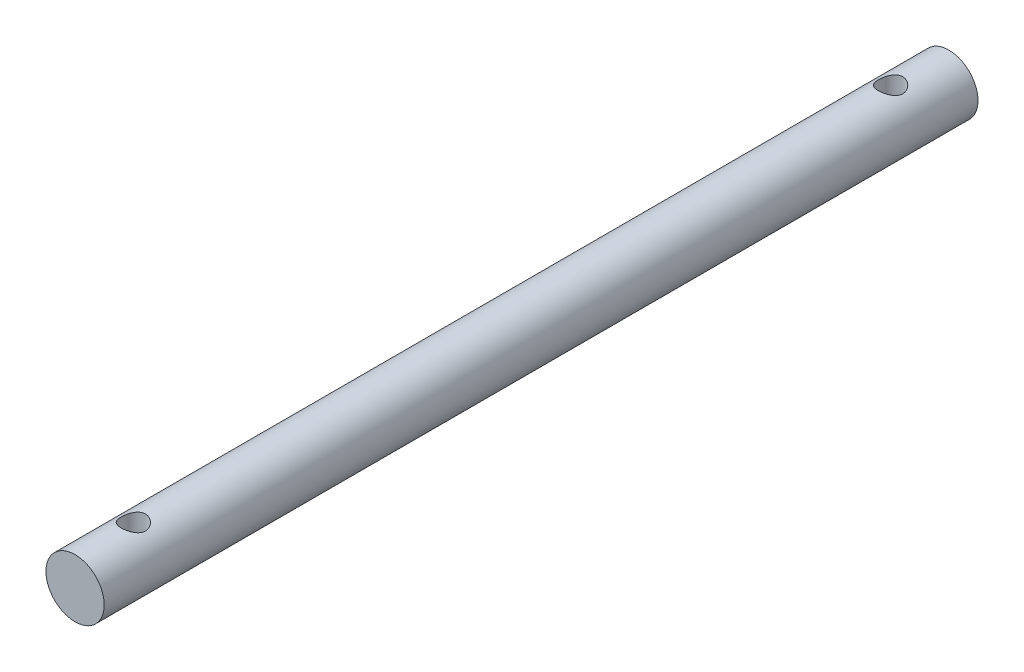
ISO-10303-21;
HEADER;
FILE_DESCRIPTION(('STEP AP214'),'2;1');
FILE_NAME('part.step','',(''),(''),'','','');
FILE_SCHEMA(('AUTOMOTIVE_DESIGN { 1 0 10303 214 1 1 1 1 }'));
ENDSEC;
DATA;
#1=APPLICATION_CONTEXT('core data for automotive mechanical design processes');
#2=APPLICATION_PROTOCOL_DEFINITION('international standard','automotive_design',2000,#1);
#3=PRODUCT_CONTEXT('',#1,'mechanical');
#4=PRODUCT('Part','Part','',(#3));
#5=PRODUCT_RELATED_PRODUCT_CATEGORY('part','',(#4));
#6=PRODUCT_DEFINITION_FORMATION('','',#4);
#7=PRODUCT_DEFINITION_CONTEXT('part definition',#1,'design');
#8=PRODUCT_DEFINITION('design','',#6,#7);
#9=PRODUCT_DEFINITION_SHAPE('','',#8);
#10=(LENGTH_UNIT() NAMED_UNIT(*) SI_UNIT(.MILLI.,.METRE.));
#11=(NAMED_UNIT(*) PLANE_ANGLE_UNIT() SI_UNIT($,.RADIAN.));
#12=(NAMED_UNIT(*) SI_UNIT($,.STERADIAN.) SOLID_ANGLE_UNIT());
#13=UNCERTAINTY_MEASURE_WITH_UNIT(LENGTH_MEASURE(1.E-05),#10,'distance_accuracy_value','');
#14=(GEOMETRIC_REPRESENTATION_CONTEXT(3) GLOBAL_UNCERTAINTY_ASSIGNED_CONTEXT((#13)) GLOBAL_UNIT_ASSIGNED_CONTEXT((#10,
#11,#12)) REPRESENTATION_CONTEXT('',''));
#15=CARTESIAN_POINT('',(0.,0.,0.));
#16=DIRECTION('',(0.,0.,1.));
#17=DIRECTION('',(1.,0.,0.));
#18=AXIS2_PLACEMENT_3D('',#15,#16,#17);
#19=CARTESIAN_POINT('',(0.,0.,75.));
#20=DIRECTION('',(0.,0.,-1.));
#21=DIRECTION('',(-1.,0.,0.));
#22=AXIS2_PLACEMENT_3D('',#19,#20,#21);
#23=CYLINDRICAL_SURFACE('',#22,5.);
#24=CARTESIAN_POINT('',(0.,-5.,-62.9172));
#25=CARTESIAN_POINT('',(0.111578839237877,-4.99999352611889,-62.9172085313426));
#26=CARTESIAN_POINT('',(0.223319012424018,-4.99622299792187,-62.9262170888932));
#27=CARTESIAN_POINT('',(0.443639965609425,-4.98151051378845,-62.9619233164241));
#28=CARTESIAN_POINT('',(0.552211724531302,-4.97054983959883,-62.9886671590212));
#29=CARTESIAN_POINT('',(0.762637813677016,-4.94263183056272,-63.0586888874491));
#30=CARTESIAN_POINT('',(0.864513539096639,-4.9256948193072,-63.1019107763548));
#31=CARTESIAN_POINT('',(1.05947015937177,-4.88747422640062,-63.2034295529761));
#32=CARTESIAN_POINT('',(1.1525537090778,-4.86619196300104,-63.2617218700882));
#33=CARTESIAN_POINT('',(1.33210266923288,-4.8202160508905,-63.3948171856856));
#34=CARTESIAN_POINT('',(1.41806885086017,-4.79541072012145,-63.4702547327041));
#35=CARTESIAN_POINT('',(1.57655871227419,-4.74566918585628,-63.634157394833));
#36=CARTESIAN_POINT('',(1.64907531762347,-4.72073292053983,-63.7226293223374));
#37=CARTESIAN_POINT('',(1.78213062864076,-4.67218133245092,-63.9153630572728));
#38=CARTESIAN_POINT('',(1.8419050314518,-4.64869125387419,-64.0201873654964));
#39=CARTESIAN_POINT('',(1.94275027532528,-4.60746260126555,-64.2395231219599));
#40=CARTESIAN_POINT('',(1.98383074680611,-4.58972106715691,-64.3540295461971));
#41=CARTESIAN_POINT('',(2.04406079669718,-4.56320694049893,-64.5837332786116));
#42=CARTESIAN_POINT('',(2.06417113146594,-4.55404361538577,-64.6986318296722));
#43=CARTESIAN_POINT('',(2.08488749033923,-4.54459982951746,-64.9305097997338));
#44=CARTESIAN_POINT('',(2.08550426308689,-4.54431447350023,-65.0474880364013));
#45=CARTESIAN_POINT('',(2.06793967707762,-4.55232816500195,-65.270637357096));
#46=CARTESIAN_POINT('',(2.05119486765147,-4.55997121588493,-65.3769498041593));
#47=CARTESIAN_POINT('',(2.00179196698369,-4.58187201985296,-65.5850902574139));
#48=CARTESIAN_POINT('',(1.96913083000994,-4.59613103893789,-65.6869174012341));
#49=CARTESIAN_POINT('',(1.88818582440475,-4.62997911345461,-65.8857672318324));
#50=CARTESIAN_POINT('',(1.83958437790097,-4.64967510727197,-65.9826416222216));
#51=CARTESIAN_POINT('',(1.72836290361203,-4.69215298959224,-66.1672364124542));
#52=CARTESIAN_POINT('',(1.66573734904345,-4.71493609329753,-66.2549531833197));
#53=CARTESIAN_POINT('',(1.52203554936883,-4.76336226991448,-66.4265406013061));
#54=CARTESIAN_POINT('',(1.43984766595044,-4.78908436874535,-66.5094606024356));
#55=CARTESIAN_POINT('',(1.26247754272713,-4.83886652769924,-66.6606595573554));
#56=CARTESIAN_POINT('',(1.16729227059112,-4.86292619799398,-66.7289350849604));
#57=CARTESIAN_POINT('',(0.963741693542967,-4.90737057985103,-66.8503000927225));
#58=CARTESIAN_POINT('',(0.85512308190473,-4.9276577575799,-66.9030030944711));
#59=CARTESIAN_POINT('',(0.629500646703871,-4.96152281632328,-66.9890549428822));
#60=CARTESIAN_POINT('',(0.512501495081699,-4.97510440271275,-67.0224144801359));
#61=CARTESIAN_POINT('',(0.281383729827673,-4.99333592901465,-67.0668431717508));
#62=CARTESIAN_POINT('',(0.167550576073585,-4.99849621426135,-67.0791881163663));
#63=CARTESIAN_POINT('',(-0.0606683795686175,-5.00093257961239,-67.085040451009));
#64=CARTESIAN_POINT('',(-0.175054013489798,-4.99821092181108,-67.0785532458063));
#65=CARTESIAN_POINT('',(-0.395157883551416,-4.98552023027164,-67.0478389487868));
#66=CARTESIAN_POINT('',(-0.501024627502128,-4.97591732886794,-67.0245076336567));
#67=CARTESIAN_POINT('',(-0.707225848113549,-4.95082084594231,-66.9620139264874));
#68=CARTESIAN_POINT('',(-0.807559623940789,-4.93532652013647,-66.9228495341617));
#69=CARTESIAN_POINT('',(-1.0033644366732,-4.89933482567853,-66.8285220406079));
#70=CARTESIAN_POINT('',(-1.09858762348927,-4.87869700331781,-66.7728997789957));
#71=CARTESIAN_POINT('',(-1.27868947331235,-4.83462135946758,-66.6477400695951));
#72=CARTESIAN_POINT('',(-1.36356379448715,-4.81118237086842,-66.5781968134029));
#73=CARTESIAN_POINT('',(-1.52693082395876,-4.76196109641621,-66.4213572892763));
#74=CARTESIAN_POINT('',(-1.60453462845641,-4.73613102114872,-66.3331477438395));
#75=CARTESIAN_POINT('',(-1.74408593677899,-4.68654059167354,-66.1445454718256));
#76=CARTESIAN_POINT('',(-1.80602989186092,-4.66278070739839,-66.0441499913593));
#77=CARTESIAN_POINT('',(-1.9131698088376,-4.61986733544978,-65.8319575429006));
#78=CARTESIAN_POINT('',(-1.95811523698896,-4.60078411286183,-65.7200188150495));
#79=CARTESIAN_POINT('',(-2.0281377552707,-4.57035469511807,-65.4891174404748));
#80=CARTESIAN_POINT('',(-2.0532312167836,-4.55900212577885,-65.3701606685309));
#81=CARTESIAN_POINT('',(-2.08121092227558,-4.546292500991,-65.138462702675));
#82=CARTESIAN_POINT('',(-2.08565734301445,-4.54423354990784,-65.0259475445887));
#83=CARTESIAN_POINT('',(-2.07638141887455,-4.54847965046607,-64.8018412297273));
#84=CARTESIAN_POINT('',(-2.06266185975598,-4.55478341968127,-64.690249933918));
#85=CARTESIAN_POINT('',(-2.01875368880368,-4.57440330637311,-64.4765057024738));
#86=CARTESIAN_POINT('',(-1.9893606490596,-4.587379678213,-64.3741551764579));
#87=CARTESIAN_POINT('',(-1.91571760454601,-4.6186164021436,-64.1758147557816));
#88=CARTESIAN_POINT('',(-1.87146342553576,-4.63687823863195,-64.0798266572991));
#89=CARTESIAN_POINT('',(-1.76629007889278,-4.67798939462019,-63.890638210433));
#90=CARTESIAN_POINT('',(-1.70452907061439,-4.70104848550414,-63.7979522690623));
#91=CARTESIAN_POINT('',(-1.56727695569501,-4.74856977791449,-63.6237714282334));
#92=CARTESIAN_POINT('',(-1.49178109219644,-4.77303246353869,-63.5422804231859));
#93=CARTESIAN_POINT('',(-1.32266880834097,-4.82274303556312,-63.3867004293451));
#94=CARTESIAN_POINT('',(-1.22813347085227,-4.84791849209798,-63.313581809118));
#95=CARTESIAN_POINT('',(-1.02723196478461,-4.89442859471814,-63.1841974495891));
#96=CARTESIAN_POINT('',(-0.920860434689462,-4.91576148866119,-63.1279393906897));
#97=CARTESIAN_POINT('',(-0.70081450435893,-4.95187124133543,-63.0350827585008));
#98=CARTESIAN_POINT('',(-0.587290054970509,-4.96675073386859,-62.9981743073678));
#99=CARTESIAN_POINT('',(-0.413290358935195,-4.98323311937213,-62.9577454240892));
#100=CARTESIAN_POINT('',(-0.354724869414161,-4.98775301853255,-62.946761218251));
#101=CARTESIAN_POINT('',(-0.236757109776071,-4.99473910975771,-62.9298454651235));
#102=CARTESIAN_POINT('',(-0.177355417767849,-4.99720665602276,-62.9239105860867));
#103=CARTESIAN_POINT('',(-0.0785873331444452,-4.99953751605375,-62.9183107151627));
#104=CARTESIAN_POINT('',(-0.0393036757505054,-5.00000228042634,-62.9171969948323));
#105=CARTESIAN_POINT('',(0.,-5.,-62.9172));
#106=B_SPLINE_CURVE_WITH_KNOTS('',3,(#24,#25,#26,#27,#28,#29,#30,#31,#32,#33,#34,#35,#36,#37,
#38,#39,#40,#41,#42,#43,#44,#45,#46,#47,#48,#49,#50,#51,#52,#53,#54,#55,#56,#57,#58,#59,#60,#61,
#62,#63,#64,#65,#66,#67,#68,#69,#70,#71,#72,#73,#74,#75,#76,#77,#78,#79,#80,#81,#82,#83,#84,#85,
#86,#87,#88,#89,#90,#91,#92,#93,#94,#95,#96,#97,#98,#99,#100,#101,#102,#103,#104,#105),
.UNSPECIFIED.,.T.,.F.,(4,2,2,2,2,2,2,2,2,2,2,2,2,2,2,2,2,2,2,2,2,2,2,2,2,2,2,2,2,2,2,2,2,2,2,2,
2,2,2,2,4),(0.,0.334600043829472,0.67007463416241,1.00441920756949,1.33866249869128,
1.68823315623671,2.03798716865294,2.4049390788979,2.77170173455536,3.12080424300238,
3.46971425488167,3.7918934430007,4.11413430722269,4.44323056336708,4.77245674254455,
5.1294906971993,5.48660809175687,5.85196025726745,6.21711030993291,6.55917714026763,
6.90114580816266,7.22615434158648,7.55120394810583,7.88635015367637,8.22163648841091,
8.58087260900192,8.94019006474407,9.30461413561882,9.66873736158076,10.0048429458155,
10.3408969940949,10.6613227106794,10.9818385047717,11.3216207268548,11.6615208521288,
12.0261588697758,12.3909627374663,12.7497306880606,12.9287993022251,13.1077496679258,
13.2256126222153),.UNSPECIFIED.);
#107=CARTESIAN_POINT('',(0.,-5.,-62.9172));
#108=VERTEX_POINT('',#107);
#109=EDGE_CURVE('E10',#108,#108,#106,.T.);
#110=ORIENTED_EDGE('',*,*,#109,.T.);
#111=EDGE_LOOP('',(#110));
#112=FACE_BOUND('',#111,.T.);
#113=CARTESIAN_POINT('',(0.,5.,-62.9172));
#114=CARTESIAN_POINT('',(-0.111578839237877,4.99999352611889,-62.9172085313426));
#115=CARTESIAN_POINT('',(-0.223319012424018,4.99622299792187,-62.9262170888932));
#116=CARTESIAN_POINT('',(-0.443639965609425,4.98151051378845,-62.9619233164241));
#117=CARTESIAN_POINT('',(-0.552211724531302,4.97054983959883,-62.9886671590212));
#118=CARTESIAN_POINT('',(-0.762637813677016,4.94263183056272,-63.0586888874491));
#119=CARTESIAN_POINT('',(-0.864513539096639,4.9256948193072,-63.1019107763548));
#120=CARTESIAN_POINT('',(-1.05947015937177,4.88747422640062,-63.2034295529761));
#121=CARTESIAN_POINT('',(-1.1525537090778,4.86619196300104,-63.2617218700882));
#122=CARTESIAN_POINT('',(-1.33210266923288,4.8202160508905,-63.3948171856856));
#123=CARTESIAN_POINT('',(-1.41806885086017,4.79541072012145,-63.4702547327041));
#124=CARTESIAN_POINT('',(-1.57655871227419,4.74566918585628,-63.634157394833));
#125=CARTESIAN_POINT('',(-1.64907531762347,4.72073292053983,-63.7226293223374));
#126=CARTESIAN_POINT('',(-1.78213062864076,4.67218133245092,-63.9153630572728));
#127=CARTESIAN_POINT('',(-1.8419050314518,4.64869125387419,-64.0201873654964));
#128=CARTESIAN_POINT('',(-1.94275027532528,4.60746260126555,-64.2395231219599));
#129=CARTESIAN_POINT('',(-1.98383074680611,4.58972106715691,-64.3540295461971));
#130=CARTESIAN_POINT('',(-2.04406079669718,4.56320694049893,-64.5837332786116));
#131=CARTESIAN_POINT('',(-2.06417113146594,4.55404361538577,-64.6986318296722));
#132=CARTESIAN_POINT('',(-2.08488749033923,4.54459982951746,-64.9305097997338));
#133=CARTESIAN_POINT('',(-2.08550426308689,4.54431447350023,-65.0474880364013));
#134=CARTESIAN_POINT('',(-2.06793967707762,4.55232816500195,-65.270637357096));
#135=CARTESIAN_POINT('',(-2.05119486765147,4.55997121588493,-65.3769498041593));
#136=CARTESIAN_POINT('',(-2.00179196698369,4.58187201985296,-65.5850902574139));
#137=CARTESIAN_POINT('',(-1.96913083000994,4.59613103893789,-65.6869174012341));
#138=CARTESIAN_POINT('',(-1.88818582440475,4.62997911345461,-65.8857672318324));
#139=CARTESIAN_POINT('',(-1.83958437790097,4.64967510727197,-65.9826416222216));
#140=CARTESIAN_POINT('',(-1.72836290361203,4.69215298959224,-66.1672364124542));
#141=CARTESIAN_POINT('',(-1.66573734904345,4.71493609329753,-66.2549531833197));
#142=CARTESIAN_POINT('',(-1.52203554936883,4.76336226991448,-66.4265406013061));
#143=CARTESIAN_POINT('',(-1.43984766595044,4.78908436874535,-66.5094606024356));
#144=CARTESIAN_POINT('',(-1.26247754272713,4.83886652769924,-66.6606595573554));
#145=CARTESIAN_POINT('',(-1.16729227059112,4.86292619799398,-66.7289350849604));
#146=CARTESIAN_POINT('',(-0.963741693542967,4.90737057985103,-66.8503000927225));
#147=CARTESIAN_POINT('',(-0.85512308190473,4.9276577575799,-66.9030030944711));
#148=CARTESIAN_POINT('',(-0.629500646703871,4.96152281632328,-66.9890549428822));
#149=CARTESIAN_POINT('',(-0.512501495081699,4.97510440271275,-67.0224144801359));
#150=CARTESIAN_POINT('',(-0.281383729827673,4.99333592901465,-67.0668431717508));
#151=CARTESIAN_POINT('',(-0.167550576073585,4.99849621426135,-67.0791881163663));
#152=CARTESIAN_POINT('',(0.0606683795686175,5.00093257961239,-67.085040451009));
#153=CARTESIAN_POINT('',(0.175054013489798,4.99821092181108,-67.0785532458063));
#154=CARTESIAN_POINT('',(0.395157883551416,4.98552023027164,-67.0478389487868));
#155=CARTESIAN_POINT('',(0.501024627502128,4.97591732886794,-67.0245076336567));
#156=CARTESIAN_POINT('',(0.707225848113549,4.95082084594231,-66.9620139264874));
#157=CARTESIAN_POINT('',(0.807559623940789,4.93532652013647,-66.9228495341617));
#158=CARTESIAN_POINT('',(1.0033644366732,4.89933482567853,-66.8285220406079));
#159=CARTESIAN_POINT('',(1.09858762348927,4.87869700331781,-66.7728997789957));
#160=CARTESIAN_POINT('',(1.27868947331235,4.83462135946758,-66.6477400695951));
#161=CARTESIAN_POINT('',(1.36356379448715,4.81118237086842,-66.5781968134029));
#162=CARTESIAN_POINT('',(1.52693082395876,4.76196109641621,-66.4213572892763));
#163=CARTESIAN_POINT('',(1.60453462845641,4.73613102114872,-66.3331477438395));
#164=CARTESIAN_POINT('',(1.74408593677899,4.68654059167354,-66.1445454718256));
#165=CARTESIAN_POINT('',(1.80602989186092,4.66278070739839,-66.0441499913593));
#166=CARTESIAN_POINT('',(1.9131698088376,4.61986733544978,-65.8319575429006));
#167=CARTESIAN_POINT('',(1.95811523698896,4.60078411286183,-65.7200188150495));
#168=CARTESIAN_POINT('',(2.0281377552707,4.57035469511807,-65.4891174404748));
#169=CARTESIAN_POINT('',(2.0532312167836,4.55900212577885,-65.3701606685309));
#170=CARTESIAN_POINT('',(2.08121092227558,4.546292500991,-65.138462702675));
#171=CARTESIAN_POINT('',(2.08565734301445,4.54423354990784,-65.0259475445887));
#172=CARTESIAN_POINT('',(2.07638141887455,4.54847965046607,-64.8018412297273));
#173=CARTESIAN_POINT('',(2.06266185975598,4.55478341968127,-64.690249933918));
#174=CARTESIAN_POINT('',(2.01875368880368,4.57440330637311,-64.4765057024738));
#175=CARTESIAN_POINT('',(1.9893606490596,4.587379678213,-64.3741551764579));
#176=CARTESIAN_POINT('',(1.91571760454601,4.6186164021436,-64.1758147557816));
#177=CARTESIAN_POINT('',(1.87146342553576,4.63687823863195,-64.0798266572991));
#178=CARTESIAN_POINT('',(1.76629007889278,4.67798939462019,-63.890638210433));
#179=CARTESIAN_POINT('',(1.70452907061439,4.70104848550414,-63.7979522690623));
#180=CARTESIAN_POINT('',(1.56727695569501,4.74856977791449,-63.6237714282334));
#181=CARTESIAN_POINT('',(1.49178109219644,4.77303246353869,-63.5422804231859));
#182=CARTESIAN_POINT('',(1.32266880834097,4.82274303556312,-63.3867004293451));
#183=CARTESIAN_POINT('',(1.22813347085227,4.84791849209798,-63.313581809118));
#184=CARTESIAN_POINT('',(1.02723196478461,4.89442859471814,-63.1841974495891));
#185=CARTESIAN_POINT('',(0.920860434689462,4.91576148866119,-63.1279393906897));
#186=CARTESIAN_POINT('',(0.70081450435893,4.95187124133543,-63.0350827585008));
#187=CARTESIAN_POINT('',(0.587290054970509,4.96675073386859,-62.9981743073678));
#188=CARTESIAN_POINT('',(0.413290358935195,4.98323311937213,-62.9577454240892));
#189=CARTESIAN_POINT('',(0.354724869414161,4.98775301853255,-62.946761218251));
#190=CARTESIAN_POINT('',(0.236757109776071,4.99473910975771,-62.9298454651235));
#191=CARTESIAN_POINT('',(0.177355417767849,4.99720665602276,-62.9239105860867));
#192=CARTESIAN_POINT('',(0.0785873331444452,4.99953751605375,-62.9183107151627));
#193=CARTESIAN_POINT('',(0.0393036757505054,5.00000228042634,-62.9171969948323));
#194=CARTESIAN_POINT('',(0.,5.,-62.9172));
#195=B_SPLINE_CURVE_WITH_KNOTS('',3,(#113,#114,#115,#116,#117,#118,#119,#120,#121,#122,#123,
#124,#125,#126,#127,#128,#129,#130,#131,#132,#133,#134,#135,#136,#137,#138,#139,#140,#141,#142,
#143,#144,#145,#146,#147,#148,#149,#150,#151,#152,#153,#154,#155,#156,#157,#158,#159,#160,#161,
#162,#163,#164,#165,#166,#167,#168,#169,#170,#171,#172,#173,#174,#175,#176,#177,#178,#179,#180,
#181,#182,#183,#184,#185,#186,#187,#188,#189,#190,#191,#192,#193,#194),.UNSPECIFIED.,.T.,.F.,(4,
2,2,2,2,2,2,2,2,2,2,2,2,2,2,2,2,2,2,2,2,2,2,2,2,2,2,2,2,2,2,2,2,2,2,2,2,2,2,2,4),(0.,
0.334600043829472,0.67007463416241,1.00441920756949,1.33866249869128,1.68823315623671,
2.03798716865294,2.4049390788979,2.77170173455536,3.12080424300238,3.46971425488167,
3.7918934430007,4.11413430722269,4.44323056336708,4.77245674254455,5.1294906971993,
5.48660809175687,5.85196025726745,6.21711030993291,6.55917714026763,6.90114580816266,
7.22615434158648,7.55120394810583,7.88635015367637,8.22163648841091,8.58087260900192,
8.94019006474407,9.30461413561882,9.66873736158076,10.0048429458155,10.3408969940949,
10.6613227106794,10.9818385047717,11.3216207268548,11.6615208521288,12.0261588697758,
12.3909627374663,12.7497306880606,12.9287993022251,13.1077496679258,13.2256126222153),.UNSPECIFIED.);
#196=CARTESIAN_POINT('',(0.,5.,-62.9172));
#197=VERTEX_POINT('',#196);
#198=EDGE_CURVE('E53',#197,#197,#195,.T.);
#199=ORIENTED_EDGE('',*,*,#198,.T.);
#200=EDGE_LOOP('',(#199));
#201=FACE_BOUND('',#200,.T.);
#202=CARTESIAN_POINT('',(0.,-5.,67.0828));
#203=CARTESIAN_POINT('',(0.111578839237877,-4.99999352611889,67.0827914686574));
#204=CARTESIAN_POINT('',(0.223319012424018,-4.99622299792187,67.0737829111068));
#205=CARTESIAN_POINT('',(0.443639965609425,-4.98151051378845,67.0380766835759));
#206=CARTESIAN_POINT('',(0.552211724531302,-4.97054983959883,67.0113328409788));
#207=CARTESIAN_POINT('',(0.762637813677016,-4.94263183056272,66.9413111125509));
#208=CARTESIAN_POINT('',(0.864513539096639,-4.9256948193072,66.8980892236452));
#209=CARTESIAN_POINT('',(1.05947015937177,-4.88747422640062,66.7965704470239));
#210=CARTESIAN_POINT('',(1.1525537090778,-4.86619196300104,66.7382781299118));
#211=CARTESIAN_POINT('',(1.33210266923288,-4.8202160508905,66.6051828143144));
#212=CARTESIAN_POINT('',(1.41806885086017,-4.79541072012145,66.5297452672959));
#213=CARTESIAN_POINT('',(1.57655871227419,-4.74566918585628,66.365842605167));
#214=CARTESIAN_POINT('',(1.64907531762347,-4.72073292053983,66.2773706776626));
#215=CARTESIAN_POINT('',(1.78213062864076,-4.67218133245092,66.0846369427272));
#216=CARTESIAN_POINT('',(1.8419050314518,-4.64869125387419,65.9798126345036));
#217=CARTESIAN_POINT('',(1.94275027532528,-4.60746260126555,65.7604768780401));
#218=CARTESIAN_POINT('',(1.98383074680611,-4.58972106715691,65.6459704538029));
#219=CARTESIAN_POINT('',(2.04406079669718,-4.56320694049893,65.4162667213884));
#220=CARTESIAN_POINT('',(2.06417113146594,-4.55404361538577,65.3013681703278));
#221=CARTESIAN_POINT('',(2.08488749033923,-4.54459982951746,65.0694902002662));
#222=CARTESIAN_POINT('',(2.08550426308689,-4.54431447350023,64.9525119635987));
#223=CARTESIAN_POINT('',(2.06793967707762,-4.55232816500195,64.729362642904));
#224=CARTESIAN_POINT('',(2.05119486765147,-4.55997121588493,64.6230501958407));
#225=CARTESIAN_POINT('',(2.00179196698369,-4.58187201985296,64.4149097425861));
#226=CARTESIAN_POINT('',(1.96913083000994,-4.59613103893789,64.3130825987659));
#227=CARTESIAN_POINT('',(1.88818582440475,-4.62997911345461,64.1142327681676));
#228=CARTESIAN_POINT('',(1.83958437790097,-4.64967510727197,64.0173583777784));
#229=CARTESIAN_POINT('',(1.72836290361203,-4.69215298959224,63.8327635875458));
#230=CARTESIAN_POINT('',(1.66573734904345,-4.71493609329753,63.7450468166804));
#231=CARTESIAN_POINT('',(1.52203554936883,-4.76336226991448,63.5734593986939));
#232=CARTESIAN_POINT('',(1.43984766595044,-4.78908436874535,63.4905393975644));
#233=CARTESIAN_POINT('',(1.26247754272713,-4.83886652769924,63.3393404426446));
#234=CARTESIAN_POINT('',(1.16729227059112,-4.86292619799398,63.2710649150396));
#235=CARTESIAN_POINT('',(0.963741693542967,-4.90737057985103,63.1496999072775));
#236=CARTESIAN_POINT('',(0.85512308190473,-4.9276577575799,63.0969969055289));
#237=CARTESIAN_POINT('',(0.629500646703871,-4.96152281632328,63.0109450571178));
#238=CARTESIAN_POINT('',(0.512501495081699,-4.97510440271275,62.9775855198641));
#239=CARTESIAN_POINT('',(0.281383729827673,-4.99333592901465,62.9331568282492));
#240=CARTESIAN_POINT('',(0.167550576073585,-4.99849621426135,62.9208118836337));
#241=CARTESIAN_POINT('',(-0.0606683795686174,-5.00093257961239,62.914959548991));
#242=CARTESIAN_POINT('',(-0.175054013489798,-4.99821092181108,62.9214467541937));
#243=CARTESIAN_POINT('',(-0.395157883551416,-4.98552023027164,62.9521610512132));
#244=CARTESIAN_POINT('',(-0.501024627502128,-4.97591732886794,62.9754923663434));
#245=CARTESIAN_POINT('',(-0.707225848113548,-4.95082084594231,63.0379860735126));
#246=CARTESIAN_POINT('',(-0.807559623940788,-4.93532652013647,63.0771504658383));
#247=CARTESIAN_POINT('',(-1.00336443667321,-4.89933482567853,63.1714779593921));
#248=CARTESIAN_POINT('',(-1.09858762348928,-4.87869700331781,63.2271002210043));
#249=CARTESIAN_POINT('',(-1.27868947331236,-4.83462135946757,63.3522599304049));
#250=CARTESIAN_POINT('',(-1.36356379448715,-4.81118237086842,63.4218031865971));
#251=CARTESIAN_POINT('',(-1.52693082395876,-4.76196109641621,63.5786427107237));
#252=CARTESIAN_POINT('',(-1.60453462845641,-4.73613102114872,63.6668522561605));
#253=CARTESIAN_POINT('',(-1.744085936779,-4.68654059167354,63.8554545281744));
#254=CARTESIAN_POINT('',(-1.80602989186092,-4.66278070739839,63.9558500086407));
#255=CARTESIAN_POINT('',(-1.9131698088376,-4.61986733544978,64.1680424570994));
#256=CARTESIAN_POINT('',(-1.95811523698896,-4.60078411286183,64.2799811849505));
#257=CARTESIAN_POINT('',(-2.0281377552707,-4.57035469511807,64.5108825595252));
#258=CARTESIAN_POINT('',(-2.0532312167836,-4.55900212577885,64.6298393314691));
#259=CARTESIAN_POINT('',(-2.08121092227558,-4.546292500991,64.861537297325));
#260=CARTESIAN_POINT('',(-2.08565734301445,-4.54423354990784,64.9740524554113));
#261=CARTESIAN_POINT('',(-2.07638141887455,-4.54847965046607,65.1981587702727));
#262=CARTESIAN_POINT('',(-2.06266185975598,-4.55478341968127,65.309750066082));
#263=CARTESIAN_POINT('',(-2.01875368880368,-4.57440330637311,65.5234942975261));
#264=CARTESIAN_POINT('',(-1.9893606490596,-4.587379678213,65.625844823542));
#265=CARTESIAN_POINT('',(-1.91571760454601,-4.6186164021436,65.8241852442184));
#266=CARTESIAN_POINT('',(-1.87146342553576,-4.63687823863195,65.9201733427009));
#267=CARTESIAN_POINT('',(-1.76629007889278,-4.67798939462019,66.109361789567));
#268=CARTESIAN_POINT('',(-1.70452907061439,-4.70104848550414,66.2020477309377));
#269=CARTESIAN_POINT('',(-1.56727695569501,-4.74856977791449,66.3762285717666));
#270=CARTESIAN_POINT('',(-1.49178109219644,-4.77303246353869,66.4577195768141));
#271=CARTESIAN_POINT('',(-1.32266880834097,-4.82274303556312,66.6132995706549));
#272=CARTESIAN_POINT('',(-1.22813347085227,-4.84791849209798,66.686418190882));
#273=CARTESIAN_POINT('',(-1.02723196478461,-4.89442859471814,66.8158025504109));
#274=CARTESIAN_POINT('',(-0.920860434689462,-4.91576148866119,66.8720606093103));
#275=CARTESIAN_POINT('',(-0.70081450435893,-4.95187124133543,66.9649172414992));
#276=CARTESIAN_POINT('',(-0.587290054970509,-4.96675073386859,67.0018256926322));
#277=CARTESIAN_POINT('',(-0.413290358935195,-4.98323311937213,67.0422545759108));
#278=CARTESIAN_POINT('',(-0.354724869414161,-4.98775301853255,67.053238781749));
#279=CARTESIAN_POINT('',(-0.236757109776071,-4.99473910975771,67.0701545348765));
#280=CARTESIAN_POINT('',(-0.177355417767849,-4.99720665602276,67.0760894139133));
#281=CARTESIAN_POINT('',(-0.0785873331444452,-4.99953751605375,67.0816892848373));
#282=CARTESIAN_POINT('',(-0.0393036757505054,-5.00000228042634,67.0828030051677));
#283=CARTESIAN_POINT('',(0.,-5.,67.0828));
#284=B_SPLINE_CURVE_WITH_KNOTS('',3,(#202,#203,#204,#205,#206,#207,#208,#209,#210,#211,#212,
#213,#214,#215,#216,#217,#218,#219,#220,#221,#222,#223,#224,#225,#226,#227,#228,#229,#230,#231,
#232,#233,#234,#235,#236,#237,#238,#239,#240,#241,#242,#243,#244,#245,#246,#247,#248,#249,#250,
#251,#252,#253,#254,#255,#256,#257,#258,#259,#260,#261,#262,#263,#264,#265,#266,#267,#268,#269,
#270,#271,#272,#273,#274,#275,#276,#277,#278,#279,#280,#281,#282,#283),.UNSPECIFIED.,.T.,.F.,(4,
2,2,2,2,2,2,2,2,2,2,2,2,2,2,2,2,2,2,2,2,2,2,2,2,2,2,2,2,2,2,2,2,2,2,2,2,2,2,2,4),(0.,
0.334600043829472,0.67007463416241,1.00441920756949,1.33866249869128,1.68823315623671,
2.03798716865294,2.4049390788979,2.77170173455536,3.12080424300238,3.46971425488167,
3.7918934430007,4.11413430722269,4.44323056336708,4.77245674254455,5.1294906971993,
5.48660809175687,5.85196025726745,6.21711030993291,6.55917714026763,6.90114580816266,
7.22615434158648,7.55120394810583,7.88635015367638,8.22163648841091,8.58087260900192,
8.94019006474407,9.30461413561882,9.66873736158077,10.0048429458155,10.3408969940949,
10.6613227106794,10.9818385047717,11.3216207268548,11.6615208521288,12.0261588697758,
12.3909627374663,12.7497306880606,12.9287993022251,13.1077496679258,13.2256126222153),.UNSPECIFIED.);
#285=CARTESIAN_POINT('',(0.,-5.,67.0828));
#286=VERTEX_POINT('',#285);
#287=EDGE_CURVE('E58',#286,#286,#284,.T.);
#288=ORIENTED_EDGE('',*,*,#287,.T.);
#289=EDGE_LOOP('',(#288));
#290=FACE_BOUND('',#289,.T.);
#291=CARTESIAN_POINT('',(0.,5.,67.0828));
#292=CARTESIAN_POINT('',(-0.111578839237877,4.99999352611889,67.0827914686574));
#293=CARTESIAN_POINT('',(-0.223319012424018,4.99622299792187,67.0737829111068));
#294=CARTESIAN_POINT('',(-0.443639965609425,4.98151051378845,67.0380766835759));
#295=CARTESIAN_POINT('',(-0.552211724531302,4.97054983959883,67.0113328409788));
#296=CARTESIAN_POINT('',(-0.762637813677016,4.94263183056272,66.9413111125509));
#297=CARTESIAN_POINT('',(-0.864513539096639,4.9256948193072,66.8980892236452));
#298=CARTESIAN_POINT('',(-1.05947015937177,4.88747422640062,66.7965704470239));
#299=CARTESIAN_POINT('',(-1.1525537090778,4.86619196300104,66.7382781299118));
#300=CARTESIAN_POINT('',(-1.33210266923288,4.8202160508905,66.6051828143144));
#301=CARTESIAN_POINT('',(-1.41806885086017,4.79541072012145,66.5297452672959));
#302=CARTESIAN_POINT('',(-1.57655871227419,4.74566918585628,66.365842605167));
#303=CARTESIAN_POINT('',(-1.64907531762347,4.72073292053983,66.2773706776626));
#304=CARTESIAN_POINT('',(-1.78213062864076,4.67218133245092,66.0846369427272));
#305=CARTESIAN_POINT('',(-1.8419050314518,4.64869125387419,65.9798126345036));
#306=CARTESIAN_POINT('',(-1.94275027532528,4.60746260126555,65.7604768780401));
#307=CARTESIAN_POINT('',(-1.98383074680611,4.58972106715691,65.6459704538029));
#308=CARTESIAN_POINT('',(-2.04406079669718,4.56320694049893,65.4162667213884));
#309=CARTESIAN_POINT('',(-2.06417113146594,4.55404361538577,65.3013681703278));
#310=CARTESIAN_POINT('',(-2.08488749033923,4.54459982951746,65.0694902002662));
#311=CARTESIAN_POINT('',(-2.08550426308689,4.54431447350023,64.9525119635987));
#312=CARTESIAN_POINT('',(-2.06793967707762,4.55232816500195,64.729362642904));
#313=CARTESIAN_POINT('',(-2.05119486765147,4.55997121588493,64.6230501958407));
#314=CARTESIAN_POINT('',(-2.00179196698369,4.58187201985296,64.4149097425861));
#315=CARTESIAN_POINT('',(-1.96913083000994,4.59613103893789,64.3130825987659));
#316=CARTESIAN_POINT('',(-1.88818582440475,4.62997911345461,64.1142327681676));
#317=CARTESIAN_POINT('',(-1.83958437790097,4.64967510727197,64.0173583777784));
#318=CARTESIAN_POINT('',(-1.72836290361203,4.69215298959224,63.8327635875458));
#319=CARTESIAN_POINT('',(-1.66573734904345,4.71493609329753,63.7450468166804));
#320=CARTESIAN_POINT('',(-1.52203554936883,4.76336226991448,63.5734593986939));
#321=CARTESIAN_POINT('',(-1.43984766595044,4.78908436874535,63.4905393975644));
#322=CARTESIAN_POINT('',(-1.26247754272713,4.83886652769924,63.3393404426446));
#323=CARTESIAN_POINT('',(-1.16729227059112,4.86292619799398,63.2710649150396));
#324=CARTESIAN_POINT('',(-0.963741693542967,4.90737057985103,63.1496999072775));
#325=CARTESIAN_POINT('',(-0.85512308190473,4.9276577575799,63.0969969055289));
#326=CARTESIAN_POINT('',(-0.629500646703871,4.96152281632328,63.0109450571178));
#327=CARTESIAN_POINT('',(-0.512501495081699,4.97510440271275,62.9775855198641));
#328=CARTESIAN_POINT('',(-0.281383729827673,4.99333592901465,62.9331568282492));
#329=CARTESIAN_POINT('',(-0.167550576073585,4.99849621426135,62.9208118836337));
#330=CARTESIAN_POINT('',(0.0606683795686174,5.00093257961239,62.914959548991));
#331=CARTESIAN_POINT('',(0.175054013489798,4.99821092181108,62.9214467541937));
#332=CARTESIAN_POINT('',(0.395157883551416,4.98552023027164,62.9521610512132));
#333=CARTESIAN_POINT('',(0.501024627502128,4.97591732886794,62.9754923663434));
#334=CARTESIAN_POINT('',(0.707225848113548,4.95082084594231,63.0379860735126));
#335=CARTESIAN_POINT('',(0.807559623940788,4.93532652013647,63.0771504658383));
#336=CARTESIAN_POINT('',(1.00336443667321,4.89933482567853,63.1714779593921));
#337=CARTESIAN_POINT('',(1.09858762348928,4.87869700331781,63.2271002210043));
#338=CARTESIAN_POINT('',(1.27868947331236,4.83462135946757,63.3522599304049));
#339=CARTESIAN_POINT('',(1.36356379448715,4.81118237086842,63.4218031865971));
#340=CARTESIAN_POINT('',(1.52693082395876,4.76196109641621,63.5786427107237));
#341=CARTESIAN_POINT('',(1.60453462845641,4.73613102114872,63.6668522561605));
#342=CARTESIAN_POINT('',(1.744085936779,4.68654059167354,63.8554545281744));
#343=CARTESIAN_POINT('',(1.80602989186092,4.66278070739839,63.9558500086407));
#344=CARTESIAN_POINT('',(1.9131698088376,4.61986733544978,64.1680424570994));
#345=CARTESIAN_POINT('',(1.95811523698896,4.60078411286183,64.2799811849505));
#346=CARTESIAN_POINT('',(2.0281377552707,4.57035469511807,64.5108825595252));
#347=CARTESIAN_POINT('',(2.0532312167836,4.55900212577885,64.6298393314691));
#348=CARTESIAN_POINT('',(2.08121092227558,4.546292500991,64.861537297325));
#349=CARTESIAN_POINT('',(2.08565734301445,4.54423354990784,64.9740524554113));
#350=CARTESIAN_POINT('',(2.07638141887455,4.54847965046607,65.1981587702727));
#351=CARTESIAN_POINT('',(2.06266185975598,4.55478341968127,65.309750066082));
#352=CARTESIAN_POINT('',(2.01875368880368,4.57440330637311,65.5234942975261));
#353=CARTESIAN_POINT('',(1.9893606490596,4.587379678213,65.625844823542));
#354=CARTESIAN_POINT('',(1.91571760454601,4.6186164021436,65.8241852442184));
#355=CARTESIAN_POINT('',(1.87146342553576,4.63687823863195,65.9201733427009));
#356=CARTESIAN_POINT('',(1.76629007889278,4.67798939462019,66.109361789567));
#357=CARTESIAN_POINT('',(1.70452907061439,4.70104848550414,66.2020477309377));
#358=CARTESIAN_POINT('',(1.56727695569501,4.74856977791449,66.3762285717666));
#359=CARTESIAN_POINT('',(1.49178109219644,4.77303246353869,66.4577195768141));
#360=CARTESIAN_POINT('',(1.32266880834097,4.82274303556312,66.6132995706549));
#361=CARTESIAN_POINT('',(1.22813347085227,4.84791849209798,66.686418190882));
#362=CARTESIAN_POINT('',(1.02723196478461,4.89442859471814,66.8158025504109));
#363=CARTESIAN_POINT('',(0.920860434689462,4.91576148866119,66.8720606093103));
#364=CARTESIAN_POINT('',(0.70081450435893,4.95187124133543,66.9649172414992));
#365=CARTESIAN_POINT('',(0.587290054970509,4.96675073386859,67.0018256926322));
#366=CARTESIAN_POINT('',(0.413290358935195,4.98323311937213,67.0422545759108));
#367=CARTESIAN_POINT('',(0.354724869414161,4.98775301853255,67.053238781749));
#368=CARTESIAN_POINT('',(0.236757109776071,4.99473910975771,67.0701545348765));
#369=CARTESIAN_POINT('',(0.177355417767849,4.99720665602276,67.0760894139133));
#370=CARTESIAN_POINT('',(0.0785873331444452,4.99953751605375,67.0816892848373));
#371=CARTESIAN_POINT('',(0.0393036757505054,5.00000228042634,67.0828030051677));
#372=CARTESIAN_POINT('',(0.,5.,67.0828));
#373=B_SPLINE_CURVE_WITH_KNOTS('',3,(#291,#292,#293,#294,#295,#296,#297,#298,#299,#300,#301,
#302,#303,#304,#305,#306,#307,#308,#309,#310,#311,#312,#313,#314,#315,#316,#317,#318,#319,#320,
#321,#322,#323,#324,#325,#326,#327,#328,#329,#330,#331,#332,#333,#334,#335,#336,#337,#338,#339,
#340,#341,#342,#343,#344,#345,#346,#347,#348,#349,#350,#351,#352,#353,#354,#355,#356,#357,#358,
#359,#360,#361,#362,#363,#364,#365,#366,#367,#368,#369,#370,#371,#372),.UNSPECIFIED.,.T.,.F.,(4,
2,2,2,2,2,2,2,2,2,2,2,2,2,2,2,2,2,2,2,2,2,2,2,2,2,2,2,2,2,2,2,2,2,2,2,2,2,2,2,4),(0.,
0.334600043829472,0.67007463416241,1.00441920756949,1.33866249869128,1.68823315623671,
2.03798716865294,2.4049390788979,2.77170173455536,3.12080424300238,3.46971425488167,
3.7918934430007,4.11413430722269,4.44323056336708,4.77245674254455,5.1294906971993,
5.48660809175687,5.85196025726745,6.21711030993291,6.55917714026763,6.90114580816266,
7.22615434158648,7.55120394810583,7.88635015367638,8.22163648841091,8.58087260900192,
8.94019006474407,9.30461413561882,9.66873736158077,10.0048429458155,10.3408969940949,
10.6613227106794,10.9818385047717,11.3216207268548,11.6615208521288,12.0261588697758,
12.3909627374663,12.7497306880606,12.9287993022251,13.1077496679258,13.2256126222153),.UNSPECIFIED.);
#374=CARTESIAN_POINT('',(0.,5.,67.0828));
#375=VERTEX_POINT('',#374);
#376=EDGE_CURVE('E63',#375,#375,#373,.T.);
#377=ORIENTED_EDGE('',*,*,#376,.T.);
#378=EDGE_LOOP('',(#377));
#379=FACE_BOUND('',#378,.T.);
#380=CARTESIAN_POINT('',(0.,0.,75.));
#381=DIRECTION('',(0.,0.,1.));
#382=DIRECTION('',(1.,0.,0.));
#383=AXIS2_PLACEMENT_3D('',#380,#381,#382);
#384=CIRCLE('',#383,5.);
#385=CARTESIAN_POINT('',(5.,0.,75.));
#386=VERTEX_POINT('',#385);
#387=EDGE_CURVE('E92',#386,#386,#384,.T.);
#388=ORIENTED_EDGE('',*,*,#387,.F.);
#389=EDGE_LOOP('',(#388));
#390=FACE_BOUND('',#389,.T.);
#391=CARTESIAN_POINT('',(0.,0.,-75.));
#392=DIRECTION('',(0.,0.,1.));
#393=DIRECTION('',(1.,0.,0.));
#394=AXIS2_PLACEMENT_3D('',#391,#392,#393);
#395=CIRCLE('',#394,5.);
#396=CARTESIAN_POINT('',(5.,0.,-75.));
#397=VERTEX_POINT('',#396);
#398=EDGE_CURVE('E93',#397,#397,#395,.T.);
#399=ORIENTED_EDGE('',*,*,#398,.T.);
#400=EDGE_LOOP('',(#399));
#401=FACE_BOUND('',#400,.T.);
#402=ADVANCED_FACE('F41',(#112,#201,#290,#379,#390,#401),#23,.T.);
#403=CARTESIAN_POINT('',(0.,0.,75.));
#404=DIRECTION('',(0.,0.,1.));
#405=DIRECTION('',(1.,0.,0.));
#406=AXIS2_PLACEMENT_3D('',#403,#404,#405);
#407=PLANE('',#406);
#408=ORIENTED_EDGE('',*,*,#387,.T.);
#409=EDGE_LOOP('',(#408));
#410=FACE_BOUND('',#409,.T.);
#411=ADVANCED_FACE('F84',(#410),#407,.T.);
#412=CARTESIAN_POINT('',(0.,0.,-75.));
#413=DIRECTION('',(0.,0.,1.));
#414=DIRECTION('',(1.,0.,0.));
#415=AXIS2_PLACEMENT_3D('',#412,#413,#414);
#416=PLANE('',#415);
#417=ORIENTED_EDGE('',*,*,#398,.F.);
#418=EDGE_LOOP('',(#417));
#419=FACE_BOUND('',#418,.T.);
#420=ADVANCED_FACE('F82',(#419),#416,.F.);
#421=CARTESIAN_POINT('',(0.,-5.,65.));
#422=DIRECTION('',(0.,1.,0.));
#423=DIRECTION('',(0.,0.,1.));
#424=AXIS2_PLACEMENT_3D('',#421,#422,#423);
#425=CYLINDRICAL_SURFACE('',#424,2.0828);
#426=ORIENTED_EDGE('',*,*,#376,.F.);
#427=EDGE_LOOP('',(#426));
#428=FACE_BOUND('',#427,.T.);
#429=ORIENTED_EDGE('',*,*,#287,.F.);
#430=EDGE_LOOP('',(#429));
#431=FACE_BOUND('',#430,.T.);
#432=ADVANCED_FACE('F76',(#428,#431),#425,.F.);
#433=CARTESIAN_POINT('',(0.,-5.,-65.));
#434=DIRECTION('',(0.,1.,0.));
#435=DIRECTION('',(0.,0.,1.));
#436=AXIS2_PLACEMENT_3D('',#433,#434,#435);
#437=CYLINDRICAL_SURFACE('',#436,2.0828);
#438=ORIENTED_EDGE('',*,*,#198,.F.);
#439=EDGE_LOOP('',(#438));
#440=FACE_BOUND('',#439,.T.);
#441=ORIENTED_EDGE('',*,*,#109,.F.);
#442=EDGE_LOOP('',(#441));
#443=FACE_BOUND('',#442,.T.);
#444=ADVANCED_FACE('F73',(#440,#443),#437,.F.);
#445=CLOSED_SHELL('',(#402,#411,#420,#432,#444));
#446=MANIFOLD_SOLID_BREP('B2',#445);
#447=ADVANCED_BREP_SHAPE_REPRESENTATION('',(#18,#446),#14);
#448=SHAPE_DEFINITION_REPRESENTATION(#9,#447);
ENDSEC;
END-ISO-10303-21;
